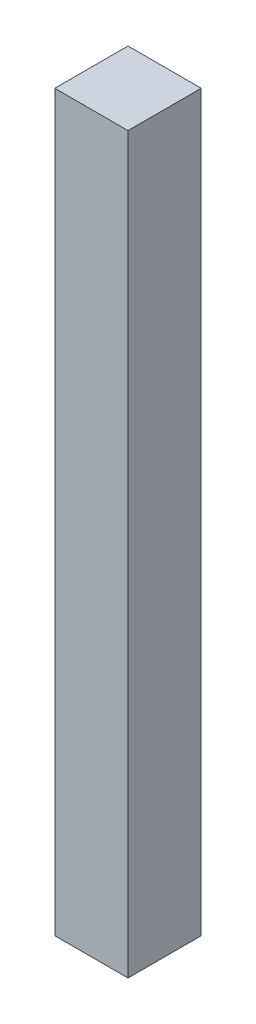
ISO-10303-21;
HEADER;
FILE_DESCRIPTION(('STEP AP214'),'2;1');
FILE_NAME('part.step','',(''),(''),'','','');
FILE_SCHEMA(('AUTOMOTIVE_DESIGN { 1 0 10303 214 1 1 1 1 }'));
ENDSEC;
DATA;
#1=APPLICATION_CONTEXT('core data for automotive mechanical design processes');
#2=APPLICATION_PROTOCOL_DEFINITION('international standard','automotive_design',2000,#1);
#3=PRODUCT_CONTEXT('',#1,'mechanical');
#4=PRODUCT('Part','Part','',(#3));
#5=PRODUCT_RELATED_PRODUCT_CATEGORY('part','',(#4));
#6=PRODUCT_DEFINITION_FORMATION('','',#4);
#7=PRODUCT_DEFINITION_CONTEXT('part definition',#1,'design');
#8=PRODUCT_DEFINITION('design','',#6,#7);
#9=PRODUCT_DEFINITION_SHAPE('','',#8);
#10=(LENGTH_UNIT() NAMED_UNIT(*) SI_UNIT(.MILLI.,.METRE.));
#11=(NAMED_UNIT(*) PLANE_ANGLE_UNIT() SI_UNIT($,.RADIAN.));
#12=(NAMED_UNIT(*) SI_UNIT($,.STERADIAN.) SOLID_ANGLE_UNIT());
#13=UNCERTAINTY_MEASURE_WITH_UNIT(LENGTH_MEASURE(1.E-05),#10,'distance_accuracy_value','');
#14=(GEOMETRIC_REPRESENTATION_CONTEXT(3) GLOBAL_UNCERTAINTY_ASSIGNED_CONTEXT((#13)) GLOBAL_UNIT_ASSIGNED_CONTEXT((#10,
#11,#12)) REPRESENTATION_CONTEXT('',''));
#15=CARTESIAN_POINT('',(0.,0.,0.));
#16=DIRECTION('',(0.,0.,1.));
#17=DIRECTION('',(1.,0.,0.));
#18=AXIS2_PLACEMENT_3D('',#15,#16,#17);
#19=CARTESIAN_POINT('',(3.08333333333333,-48.9841702409788,3.));
#20=DIRECTION('',(-1.,0.,0.));
#21=DIRECTION('',(0.,0.,1.));
#22=AXIS2_PLACEMENT_3D('',#19,#20,#21);
#23=PLANE('',#22);
#24=DIRECTION('',(0.,1.,0.));
#25=VECTOR('',#24,1.);
#26=CARTESIAN_POINT('',(3.08333333333333,-48.9841702409788,0.));
#27=LINE('',#26,#25);
#28=CARTESIAN_POINT('',(3.08333333333333,-48.9841702409788,0.));
#29=VERTEX_POINT('',#28);
#30=CARTESIAN_POINT('',(3.08333333333333,-18.9241702409788,0.));
#31=VERTEX_POINT('',#30);
#32=EDGE_CURVE('E107',#29,#31,#27,.T.);
#33=ORIENTED_EDGE('',*,*,#32,.T.);
#34=DIRECTION('',(0.,0.,-1.));
#35=VECTOR('',#34,1.);
#36=CARTESIAN_POINT('',(3.08333333333333,-18.9241702409788,3.));
#37=LINE('',#36,#35);
#38=CARTESIAN_POINT('',(3.08333333333333,-18.9241702409788,3.));
#39=VERTEX_POINT('',#38);
#40=EDGE_CURVE('E11',#39,#31,#37,.T.);
#41=ORIENTED_EDGE('',*,*,#40,.F.);
#42=DIRECTION('',(0.,1.,0.));
#43=VECTOR('',#42,1.);
#44=CARTESIAN_POINT('',(3.08333333333333,-48.9841702409788,3.));
#45=LINE('',#44,#43);
#46=CARTESIAN_POINT('',(3.08333333333333,-48.9841702409788,3.));
#47=VERTEX_POINT('',#46);
#48=EDGE_CURVE('E91',#47,#39,#45,.T.);
#49=ORIENTED_EDGE('',*,*,#48,.F.);
#50=DIRECTION('',(0.,0.,-1.));
#51=VECTOR('',#50,1.);
#52=CARTESIAN_POINT('',(3.08333333333333,-48.9841702409788,3.));
#53=LINE('',#52,#51);
#54=EDGE_CURVE('E103',#47,#29,#53,.T.);
#55=ORIENTED_EDGE('',*,*,#54,.T.);
#56=EDGE_LOOP('',(#33,#41,#49,#55));
#57=FACE_BOUND('',#56,.T.);
#58=ADVANCED_FACE('F39',(#57),#23,.F.);
#59=CARTESIAN_POINT('',(0.0833333333333315,-18.9241702409788,3.));
#60=DIRECTION('',(0.,-1.,0.));
#61=DIRECTION('',(0.,0.,-1.));
#62=AXIS2_PLACEMENT_3D('',#59,#60,#61);
#63=PLANE('',#62);
#64=DIRECTION('',(-1.,0.,0.));
#65=VECTOR('',#64,1.);
#66=CARTESIAN_POINT('',(0.0833333333333315,-18.9241702409788,0.));
#67=LINE('',#66,#65);
#68=CARTESIAN_POINT('',(0.0833333333333315,-18.9241702409788,0.));
#69=VERTEX_POINT('',#68);
#70=EDGE_CURVE('E96',#31,#69,#67,.T.);
#71=ORIENTED_EDGE('',*,*,#70,.T.);
#72=DIRECTION('',(0.,0.,-1.));
#73=VECTOR('',#72,1.);
#74=CARTESIAN_POINT('',(0.0833333333333315,-18.9241702409788,3.));
#75=LINE('',#74,#73);
#76=CARTESIAN_POINT('',(0.0833333333333315,-18.9241702409788,3.));
#77=VERTEX_POINT('',#76);
#78=EDGE_CURVE('E48',#77,#69,#75,.T.);
#79=ORIENTED_EDGE('',*,*,#78,.F.);
#80=DIRECTION('',(-1.,0.,0.));
#81=VECTOR('',#80,1.);
#82=CARTESIAN_POINT('',(0.0833333333333315,-18.9241702409788,3.));
#83=LINE('',#82,#81);
#84=EDGE_CURVE('E86',#39,#77,#83,.T.);
#85=ORIENTED_EDGE('',*,*,#84,.F.);
#86=ORIENTED_EDGE('',*,*,#40,.T.);
#87=EDGE_LOOP('',(#71,#79,#85,#86));
#88=FACE_BOUND('',#87,.T.);
#89=ADVANCED_FACE('F95',(#88),#63,.F.);
#90=CARTESIAN_POINT('',(0.0833333333333315,-18.9241702409788,3.));
#91=DIRECTION('',(1.,0.,0.));
#92=DIRECTION('',(0.,1.,0.));
#93=AXIS2_PLACEMENT_3D('',#90,#91,#92);
#94=PLANE('',#93);
#95=DIRECTION('',(0.,-1.,0.));
#96=VECTOR('',#95,1.);
#97=CARTESIAN_POINT('',(0.0833333333333315,-18.9241702409788,0.));
#98=LINE('',#97,#96);
#99=CARTESIAN_POINT('',(0.0833333333333356,-48.9841702409788,0.));
#100=VERTEX_POINT('',#99);
#101=EDGE_CURVE('E73',#69,#100,#98,.T.);
#102=ORIENTED_EDGE('',*,*,#101,.T.);
#103=DIRECTION('',(0.,0.,-1.));
#104=VECTOR('',#103,1.);
#105=CARTESIAN_POINT('',(0.0833333333333356,-48.9841702409788,3.));
#106=LINE('',#105,#104);
#107=CARTESIAN_POINT('',(0.0833333333333356,-48.9841702409788,3.));
#108=VERTEX_POINT('',#107);
#109=EDGE_CURVE('E98',#108,#100,#106,.T.);
#110=ORIENTED_EDGE('',*,*,#109,.F.);
#111=DIRECTION('',(0.,-1.,0.));
#112=VECTOR('',#111,1.);
#113=CARTESIAN_POINT('',(0.0833333333333315,-18.9241702409788,3.));
#114=LINE('',#113,#112);
#115=EDGE_CURVE('E89',#77,#108,#114,.T.);
#116=ORIENTED_EDGE('',*,*,#115,.F.);
#117=ORIENTED_EDGE('',*,*,#78,.T.);
#118=EDGE_LOOP('',(#102,#110,#116,#117));
#119=FACE_BOUND('',#118,.T.);
#120=ADVANCED_FACE('F99',(#119),#94,.F.);
#121=CARTESIAN_POINT('',(0.0833333333333356,-48.9841702409788,3.));
#122=DIRECTION('',(0.,1.,0.));
#123=DIRECTION('',(0.,0.,1.));
#124=AXIS2_PLACEMENT_3D('',#121,#122,#123);
#125=PLANE('',#124);
#126=DIRECTION('',(1.,0.,0.));
#127=VECTOR('',#126,1.);
#128=CARTESIAN_POINT('',(0.0833333333333356,-48.9841702409788,0.));
#129=LINE('',#128,#127);
#130=EDGE_CURVE('E79',#100,#29,#129,.T.);
#131=ORIENTED_EDGE('',*,*,#130,.T.);
#132=ORIENTED_EDGE('',*,*,#54,.F.);
#133=DIRECTION('',(1.,0.,0.));
#134=VECTOR('',#133,1.);
#135=CARTESIAN_POINT('',(0.0833333333333356,-48.9841702409788,3.));
#136=LINE('',#135,#134);
#137=EDGE_CURVE('E56',#108,#47,#136,.T.);
#138=ORIENTED_EDGE('',*,*,#137,.F.);
#139=ORIENTED_EDGE('',*,*,#109,.T.);
#140=EDGE_LOOP('',(#131,#132,#138,#139));
#141=FACE_BOUND('',#140,.T.);
#142=ADVANCED_FACE('F120',(#141),#125,.F.);
#143=CARTESIAN_POINT('',(0.,0.,3.));
#144=DIRECTION('',(0.,0.,-1.));
#145=DIRECTION('',(-1.,0.,0.));
#146=AXIS2_PLACEMENT_3D('',#143,#144,#145);
#147=PLANE('',#146);
#148=ORIENTED_EDGE('',*,*,#48,.T.);
#149=ORIENTED_EDGE('',*,*,#84,.T.);
#150=ORIENTED_EDGE('',*,*,#115,.T.);
#151=ORIENTED_EDGE('',*,*,#137,.T.);
#152=EDGE_LOOP('',(#148,#149,#150,#151));
#153=FACE_BOUND('',#152,.T.);
#154=ADVANCED_FACE('F87',(#153),#147,.F.);
#155=CARTESIAN_POINT('',(0.,0.,0.));
#156=DIRECTION('',(0.,0.,-1.));
#157=DIRECTION('',(-1.,0.,0.));
#158=AXIS2_PLACEMENT_3D('',#155,#156,#157);
#159=PLANE('',#158);
#160=ORIENTED_EDGE('',*,*,#32,.F.);
#161=ORIENTED_EDGE('',*,*,#130,.F.);
#162=ORIENTED_EDGE('',*,*,#101,.F.);
#163=ORIENTED_EDGE('',*,*,#70,.F.);
#164=EDGE_LOOP('',(#160,#161,#162,#163));
#165=FACE_BOUND('',#164,.T.);
#166=ADVANCED_FACE('F123',(#165),#159,.T.);
#167=CLOSED_SHELL('',(#58,#89,#120,#142,#154,#166));
#168=MANIFOLD_SOLID_BREP('B2',#167);
#169=ADVANCED_BREP_SHAPE_REPRESENTATION('',(#18,#168),#14);
#170=SHAPE_DEFINITION_REPRESENTATION(#9,#169);
ENDSEC;
END-ISO-10303-21;
